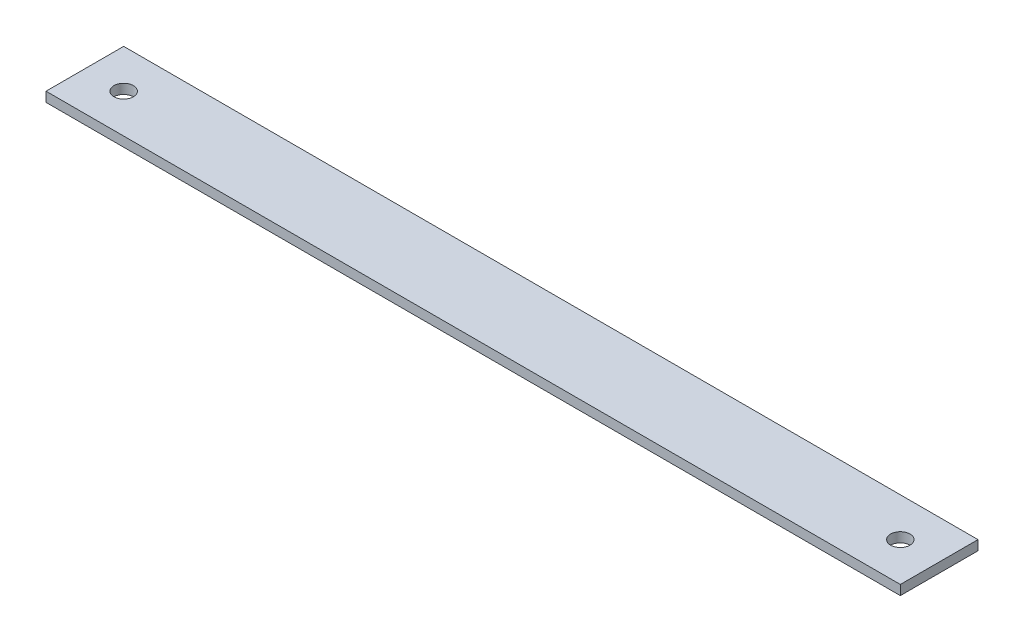
ISO-10303-21;
HEADER;
FILE_DESCRIPTION(('STEP AP214'),'2;1');
FILE_NAME('part.step','',(''),(''),'','','');
FILE_SCHEMA(('AUTOMOTIVE_DESIGN { 1 0 10303 214 1 1 1 1 }'));
ENDSEC;
DATA;
#1=APPLICATION_CONTEXT('core data for automotive mechanical design processes');
#2=APPLICATION_PROTOCOL_DEFINITION('international standard','automotive_design',2000,#1);
#3=PRODUCT_CONTEXT('',#1,'mechanical');
#4=PRODUCT('Part','Part','',(#3));
#5=PRODUCT_RELATED_PRODUCT_CATEGORY('part','',(#4));
#6=PRODUCT_DEFINITION_FORMATION('','',#4);
#7=PRODUCT_DEFINITION_CONTEXT('part definition',#1,'design');
#8=PRODUCT_DEFINITION('design','',#6,#7);
#9=PRODUCT_DEFINITION_SHAPE('','',#8);
#10=(LENGTH_UNIT() NAMED_UNIT(*) SI_UNIT(.MILLI.,.METRE.));
#11=(NAMED_UNIT(*) PLANE_ANGLE_UNIT() SI_UNIT($,.RADIAN.));
#12=(NAMED_UNIT(*) SI_UNIT($,.STERADIAN.) SOLID_ANGLE_UNIT());
#13=UNCERTAINTY_MEASURE_WITH_UNIT(LENGTH_MEASURE(1.E-05),#10,'distance_accuracy_value','');
#14=(GEOMETRIC_REPRESENTATION_CONTEXT(3) GLOBAL_UNCERTAINTY_ASSIGNED_CONTEXT((#13)) GLOBAL_UNIT_ASSIGNED_CONTEXT((#10,
#11,#12)) REPRESENTATION_CONTEXT('',''));
#15=CARTESIAN_POINT('',(0.,0.,0.));
#16=DIRECTION('',(0.,0.,1.));
#17=DIRECTION('',(1.,0.,0.));
#18=AXIS2_PLACEMENT_3D('',#15,#16,#17);
#19=CARTESIAN_POINT('',(139.7,3.175,-12.7));
#20=DIRECTION('',(-1.,0.,0.));
#21=DIRECTION('',(0.,0.,1.));
#22=AXIS2_PLACEMENT_3D('',#19,#20,#21);
#23=PLANE('',#22);
#24=DIRECTION('',(0.,0.,-1.));
#25=VECTOR('',#24,1.);
#26=CARTESIAN_POINT('',(139.7,0.,-12.7));
#27=LINE('',#26,#25);
#28=CARTESIAN_POINT('',(139.7,0.,12.7));
#29=VERTEX_POINT('',#28);
#30=CARTESIAN_POINT('',(139.7,0.,-12.7));
#31=VERTEX_POINT('',#30);
#32=EDGE_CURVE('E102',#29,#31,#27,.T.);
#33=ORIENTED_EDGE('',*,*,#32,.T.);
#34=DIRECTION('',(0.,-1.,0.));
#35=VECTOR('',#34,1.);
#36=CARTESIAN_POINT('',(139.7,3.175,-12.7));
#37=LINE('',#36,#35);
#38=CARTESIAN_POINT('',(139.7,3.175,-12.7));
#39=VERTEX_POINT('',#38);
#40=EDGE_CURVE('E11',#39,#31,#37,.T.);
#41=ORIENTED_EDGE('',*,*,#40,.F.);
#42=DIRECTION('',(0.,0.,-1.));
#43=VECTOR('',#42,1.);
#44=CARTESIAN_POINT('',(139.7,3.175,-12.7));
#45=LINE('',#44,#43);
#46=CARTESIAN_POINT('',(139.7,3.175,12.7));
#47=VERTEX_POINT('',#46);
#48=EDGE_CURVE('E90',#47,#39,#45,.T.);
#49=ORIENTED_EDGE('',*,*,#48,.F.);
#50=DIRECTION('',(0.,-1.,0.));
#51=VECTOR('',#50,1.);
#52=CARTESIAN_POINT('',(139.7,3.175,12.7));
#53=LINE('',#52,#51);
#54=EDGE_CURVE('E98',#47,#29,#53,.T.);
#55=ORIENTED_EDGE('',*,*,#54,.T.);
#56=EDGE_LOOP('',(#33,#41,#49,#55));
#57=FACE_BOUND('',#56,.T.);
#58=ADVANCED_FACE('F39',(#57),#23,.F.);
#59=CARTESIAN_POINT('',(-139.7,3.175,-12.7));
#60=DIRECTION('',(0.,0.,1.));
#61=DIRECTION('',(1.,0.,0.));
#62=AXIS2_PLACEMENT_3D('',#59,#60,#61);
#63=PLANE('',#62);
#64=DIRECTION('',(-1.,0.,0.));
#65=VECTOR('',#64,1.);
#66=CARTESIAN_POINT('',(-139.7,0.,-12.7));
#67=LINE('',#66,#65);
#68=CARTESIAN_POINT('',(-139.7,0.,-12.7));
#69=VERTEX_POINT('',#68);
#70=EDGE_CURVE('E94',#31,#69,#67,.T.);
#71=ORIENTED_EDGE('',*,*,#70,.T.);
#72=DIRECTION('',(0.,-1.,0.));
#73=VECTOR('',#72,1.);
#74=CARTESIAN_POINT('',(-139.7,3.175,-12.7));
#75=LINE('',#74,#73);
#76=CARTESIAN_POINT('',(-139.7,3.175,-12.7));
#77=VERTEX_POINT('',#76);
#78=EDGE_CURVE('E47',#77,#69,#75,.T.);
#79=ORIENTED_EDGE('',*,*,#78,.F.);
#80=DIRECTION('',(-1.,0.,0.));
#81=VECTOR('',#80,1.);
#82=CARTESIAN_POINT('',(-139.7,3.175,-12.7));
#83=LINE('',#82,#81);
#84=EDGE_CURVE('E85',#39,#77,#83,.T.);
#85=ORIENTED_EDGE('',*,*,#84,.F.);
#86=ORIENTED_EDGE('',*,*,#40,.T.);
#87=EDGE_LOOP('',(#71,#79,#85,#86));
#88=FACE_BOUND('',#87,.T.);
#89=ADVANCED_FACE('F93',(#88),#63,.F.);
#90=CARTESIAN_POINT('',(-139.7,3.175,-12.7));
#91=DIRECTION('',(1.,0.,0.));
#92=DIRECTION('',(0.,0.,-1.));
#93=AXIS2_PLACEMENT_3D('',#90,#91,#92);
#94=PLANE('',#93);
#95=DIRECTION('',(0.,0.,1.));
#96=VECTOR('',#95,1.);
#97=CARTESIAN_POINT('',(-139.7,0.,-12.7));
#98=LINE('',#97,#96);
#99=CARTESIAN_POINT('',(-139.7,0.,12.7));
#100=VERTEX_POINT('',#99);
#101=EDGE_CURVE('E72',#69,#100,#98,.T.);
#102=ORIENTED_EDGE('',*,*,#101,.T.);
#103=DIRECTION('',(0.,-1.,0.));
#104=VECTOR('',#103,1.);
#105=CARTESIAN_POINT('',(-139.7,3.175,12.7));
#106=LINE('',#105,#104);
#107=CARTESIAN_POINT('',(-139.7,3.175,12.7));
#108=VERTEX_POINT('',#107);
#109=EDGE_CURVE('E95',#108,#100,#106,.T.);
#110=ORIENTED_EDGE('',*,*,#109,.F.);
#111=DIRECTION('',(0.,0.,1.));
#112=VECTOR('',#111,1.);
#113=CARTESIAN_POINT('',(-139.7,3.175,-12.7));
#114=LINE('',#113,#112);
#115=EDGE_CURVE('E88',#77,#108,#114,.T.);
#116=ORIENTED_EDGE('',*,*,#115,.F.);
#117=ORIENTED_EDGE('',*,*,#78,.T.);
#118=EDGE_LOOP('',(#102,#110,#116,#117));
#119=FACE_BOUND('',#118,.T.);
#120=ADVANCED_FACE('F96',(#119),#94,.F.);
#121=CARTESIAN_POINT('',(-139.7,3.175,12.7));
#122=DIRECTION('',(0.,0.,-1.));
#123=DIRECTION('',(-1.,0.,0.));
#124=AXIS2_PLACEMENT_3D('',#121,#122,#123);
#125=PLANE('',#124);
#126=DIRECTION('',(1.,0.,0.));
#127=VECTOR('',#126,1.);
#128=CARTESIAN_POINT('',(-139.7,0.,12.7));
#129=LINE('',#128,#127);
#130=EDGE_CURVE('E78',#100,#29,#129,.T.);
#131=ORIENTED_EDGE('',*,*,#130,.T.);
#132=ORIENTED_EDGE('',*,*,#54,.F.);
#133=DIRECTION('',(1.,0.,0.));
#134=VECTOR('',#133,1.);
#135=CARTESIAN_POINT('',(-139.7,3.175,12.7));
#136=LINE('',#135,#134);
#137=EDGE_CURVE('E55',#108,#47,#136,.T.);
#138=ORIENTED_EDGE('',*,*,#137,.F.);
#139=ORIENTED_EDGE('',*,*,#109,.T.);
#140=EDGE_LOOP('',(#131,#132,#138,#139));
#141=FACE_BOUND('',#140,.T.);
#142=ADVANCED_FACE('F110',(#141),#125,.F.);
#143=CARTESIAN_POINT('',(0.,3.175,0.));
#144=DIRECTION('',(0.,1.,0.));
#145=DIRECTION('',(0.,0.,1.));
#146=AXIS2_PLACEMENT_3D('',#143,#144,#145);
#147=PLANE('',#146);
#148=CARTESIAN_POINT('',(-127.,3.175,0.));
#149=DIRECTION('',(0.,1.,0.));
#150=DIRECTION('',(0.,0.,1.));
#151=AXIS2_PLACEMENT_3D('',#148,#149,#150);
#152=CIRCLE('',#151,3.175);
#153=CARTESIAN_POINT('',(-127.,3.175,3.175));
#154=VERTEX_POINT('',#153);
#155=EDGE_CURVE('E119',#154,#154,#152,.T.);
#156=ORIENTED_EDGE('',*,*,#155,.F.);
#157=EDGE_LOOP('',(#156));
#158=FACE_BOUND('',#157,.T.);
#159=CARTESIAN_POINT('',(127.,3.175,0.));
#160=DIRECTION('',(0.,1.,0.));
#161=DIRECTION('',(0.,0.,-1.));
#162=AXIS2_PLACEMENT_3D('',#159,#160,#161);
#163=CIRCLE('',#162,3.175);
#164=CARTESIAN_POINT('',(127.,3.175,-3.17500000000003));
#165=VERTEX_POINT('',#164);
#166=EDGE_CURVE('E120',#165,#165,#163,.T.);
#167=ORIENTED_EDGE('',*,*,#166,.F.);
#168=EDGE_LOOP('',(#167));
#169=FACE_BOUND('',#168,.T.);
#170=ORIENTED_EDGE('',*,*,#48,.T.);
#171=ORIENTED_EDGE('',*,*,#84,.T.);
#172=ORIENTED_EDGE('',*,*,#115,.T.);
#173=ORIENTED_EDGE('',*,*,#137,.T.);
#174=EDGE_LOOP('',(#170,#171,#172,#173));
#175=FACE_BOUND('',#174,.T.);
#176=ADVANCED_FACE('F86',(#158,#169,#175),#147,.T.);
#177=CARTESIAN_POINT('',(0.,0.,0.));
#178=DIRECTION('',(0.,1.,0.));
#179=DIRECTION('',(0.,0.,1.));
#180=AXIS2_PLACEMENT_3D('',#177,#178,#179);
#181=PLANE('',#180);
#182=CARTESIAN_POINT('',(-127.,0.,0.));
#183=DIRECTION('',(0.,1.,0.));
#184=DIRECTION('',(0.,0.,1.));
#185=AXIS2_PLACEMENT_3D('',#182,#183,#184);
#186=CIRCLE('',#185,3.175);
#187=CARTESIAN_POINT('',(-127.,0.,3.175));
#188=VERTEX_POINT('',#187);
#189=EDGE_CURVE('E105',#188,#188,#186,.F.);
#190=ORIENTED_EDGE('',*,*,#189,.F.);
#191=EDGE_LOOP('',(#190));
#192=FACE_BOUND('',#191,.T.);
#193=CARTESIAN_POINT('',(127.,0.,0.));
#194=DIRECTION('',(0.,1.,0.));
#195=DIRECTION('',(0.,0.,1.));
#196=AXIS2_PLACEMENT_3D('',#193,#194,#195);
#197=CIRCLE('',#196,3.175);
#198=CARTESIAN_POINT('',(127.,0.,3.17499999999997));
#199=VERTEX_POINT('',#198);
#200=EDGE_CURVE('E116',#199,#199,#197,.F.);
#201=ORIENTED_EDGE('',*,*,#200,.F.);
#202=EDGE_LOOP('',(#201));
#203=FACE_BOUND('',#202,.T.);
#204=ORIENTED_EDGE('',*,*,#32,.F.);
#205=ORIENTED_EDGE('',*,*,#130,.F.);
#206=ORIENTED_EDGE('',*,*,#101,.F.);
#207=ORIENTED_EDGE('',*,*,#70,.F.);
#208=EDGE_LOOP('',(#204,#205,#206,#207));
#209=FACE_BOUND('',#208,.T.);
#210=ADVANCED_FACE('F113',(#192,#203,#209),#181,.F.);
#211=CARTESIAN_POINT('',(127.,-0.00100000000000013,0.));
#212=DIRECTION('',(0.,1.,0.));
#213=DIRECTION('',(0.,0.,1.));
#214=AXIS2_PLACEMENT_3D('',#211,#212,#213);
#215=CYLINDRICAL_SURFACE('',#214,3.175);
#216=ORIENTED_EDGE('',*,*,#166,.T.);
#217=EDGE_LOOP('',(#216));
#218=FACE_BOUND('',#217,.T.);
#219=ORIENTED_EDGE('',*,*,#200,.T.);
#220=EDGE_LOOP('',(#219));
#221=FACE_BOUND('',#220,.T.);
#222=ADVANCED_FACE('F136',(#218,#221),#215,.F.);
#223=CARTESIAN_POINT('',(-127.,-0.00100000000000013,0.));
#224=DIRECTION('',(0.,1.,0.));
#225=DIRECTION('',(0.,0.,1.));
#226=AXIS2_PLACEMENT_3D('',#223,#224,#225);
#227=CYLINDRICAL_SURFACE('',#226,3.175);
#228=ORIENTED_EDGE('',*,*,#155,.T.);
#229=EDGE_LOOP('',(#228));
#230=FACE_BOUND('',#229,.T.);
#231=ORIENTED_EDGE('',*,*,#189,.T.);
#232=EDGE_LOOP('',(#231));
#233=FACE_BOUND('',#232,.T.);
#234=ADVANCED_FACE('F128',(#230,#233),#227,.F.);
#235=CLOSED_SHELL('',(#58,#89,#120,#142,#176,#210,#222,#234));
#236=MANIFOLD_SOLID_BREP('B2',#235);
#237=ADVANCED_BREP_SHAPE_REPRESENTATION('',(#18,#236),#14);
#238=SHAPE_DEFINITION_REPRESENTATION(#9,#237);
ENDSEC;
END-ISO-10303-21;
